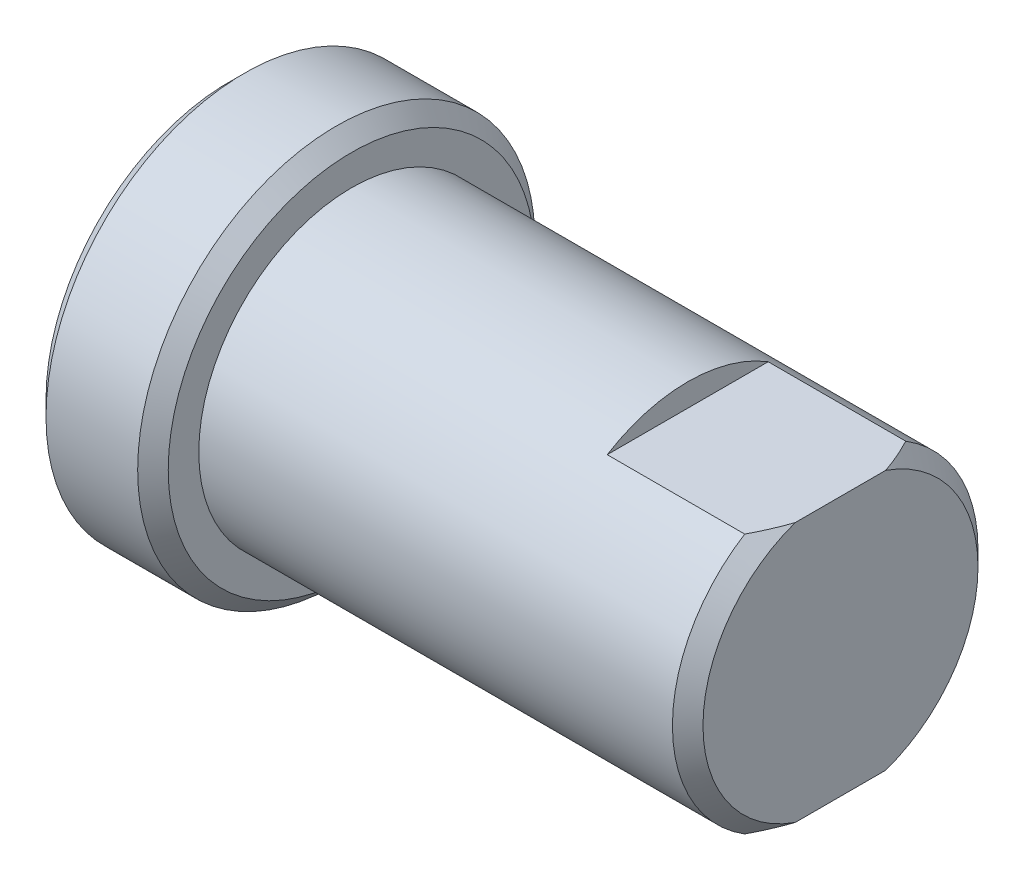
ISO-10303-21;
HEADER;
FILE_DESCRIPTION(('STEP AP214'),'2;1');
FILE_NAME('part.step','',(''),(''),'','','');
FILE_SCHEMA(('AUTOMOTIVE_DESIGN { 1 0 10303 214 1 1 1 1 }'));
ENDSEC;
DATA;
#1=APPLICATION_CONTEXT('core data for automotive mechanical design processes');
#2=APPLICATION_PROTOCOL_DEFINITION('international standard','automotive_design',2000,#1);
#3=PRODUCT_CONTEXT('',#1,'mechanical');
#4=PRODUCT('Part','Part','',(#3));
#5=PRODUCT_RELATED_PRODUCT_CATEGORY('part','',(#4));
#6=PRODUCT_DEFINITION_FORMATION('','',#4);
#7=PRODUCT_DEFINITION_CONTEXT('part definition',#1,'design');
#8=PRODUCT_DEFINITION('design','',#6,#7);
#9=PRODUCT_DEFINITION_SHAPE('','',#8);
#10=(LENGTH_UNIT() NAMED_UNIT(*) SI_UNIT(.MILLI.,.METRE.));
#11=(NAMED_UNIT(*) PLANE_ANGLE_UNIT() SI_UNIT($,.RADIAN.));
#12=(NAMED_UNIT(*) SI_UNIT($,.STERADIAN.) SOLID_ANGLE_UNIT());
#13=UNCERTAINTY_MEASURE_WITH_UNIT(LENGTH_MEASURE(1.E-05),#10,'distance_accuracy_value','');
#14=(GEOMETRIC_REPRESENTATION_CONTEXT(3) GLOBAL_UNCERTAINTY_ASSIGNED_CONTEXT((#13)) GLOBAL_UNIT_ASSIGNED_CONTEXT((#10,
#11,#12)) REPRESENTATION_CONTEXT('',''));
#15=CARTESIAN_POINT('',(0.,0.,0.));
#16=DIRECTION('',(0.,0.,1.));
#17=DIRECTION('',(1.,0.,0.));
#18=AXIS2_PLACEMENT_3D('',#15,#16,#17);
#19=CARTESIAN_POINT('',(0.,0.,0.));
#20=DIRECTION('',(-1.,0.,0.));
#21=DIRECTION('',(0.,0.,1.));
#22=AXIS2_PLACEMENT_3D('',#19,#20,#21);
#23=CYLINDRICAL_SURFACE('',#22,10.);
#24=CARTESIAN_POINT('',(39.,0.,0.));
#25=DIRECTION('',(-1.,0.,0.));
#26=DIRECTION('',(0.,0.,1.));
#27=AXIS2_PLACEMENT_3D('',#24,#25,#26);
#28=CIRCLE('',#27,10.);
#29=CARTESIAN_POINT('',(39.,-8.5,5.26782687642637));
#30=VERTEX_POINT('',#29);
#31=CARTESIAN_POINT('',(39.,8.5,5.26782687642637));
#32=VERTEX_POINT('',#31);
#33=EDGE_CURVE('E133',#30,#32,#28,.T.);
#34=ORIENTED_EDGE('',*,*,#33,.T.);
#35=DIRECTION('',(1.,0.,0.));
#36=VECTOR('',#35,1.);
#37=CARTESIAN_POINT('',(30.,8.5,5.26782687642637));
#38=LINE('',#37,#36);
#39=CARTESIAN_POINT('',(30.,8.5,5.26782687642637));
#40=VERTEX_POINT('',#39);
#41=EDGE_CURVE('E105',#40,#32,#38,.T.);
#42=ORIENTED_EDGE('',*,*,#41,.F.);
#43=CARTESIAN_POINT('',(30.,0.,0.));
#44=DIRECTION('',(1.,0.,0.));
#45=DIRECTION('',(0.,0.,-1.));
#46=AXIS2_PLACEMENT_3D('',#43,#44,#45);
#47=CIRCLE('',#46,10.);
#48=CARTESIAN_POINT('',(30.,8.5,-5.26782687642637));
#49=VERTEX_POINT('',#48);
#50=EDGE_CURVE('E106',#49,#40,#47,.T.);
#51=ORIENTED_EDGE('',*,*,#50,.F.);
#52=DIRECTION('',(1.,0.,0.));
#53=VECTOR('',#52,1.);
#54=CARTESIAN_POINT('',(30.,8.5,-5.26782687642637));
#55=LINE('',#54,#53);
#56=CARTESIAN_POINT('',(39.,8.5,-5.26782687642637));
#57=VERTEX_POINT('',#56);
#58=EDGE_CURVE('E96',#49,#57,#55,.T.);
#59=ORIENTED_EDGE('',*,*,#58,.T.);
#60=CARTESIAN_POINT('',(39.,-8.5,-5.26782687642637));
#61=VERTEX_POINT('',#60);
#62=EDGE_CURVE('E135',#57,#61,#28,.T.);
#63=ORIENTED_EDGE('',*,*,#62,.T.);
#64=DIRECTION('',(1.,0.,0.));
#65=VECTOR('',#64,1.);
#66=CARTESIAN_POINT('',(30.,-8.5,-5.26782687642637));
#67=LINE('',#66,#65);
#68=CARTESIAN_POINT('',(30.,-8.5,-5.26782687642637));
#69=VERTEX_POINT('',#68);
#70=EDGE_CURVE('E61',#69,#61,#67,.T.);
#71=ORIENTED_EDGE('',*,*,#70,.F.);
#72=CARTESIAN_POINT('',(30.,0.,0.));
#73=DIRECTION('',(1.,0.,0.));
#74=DIRECTION('',(0.,0.,-1.));
#75=AXIS2_PLACEMENT_3D('',#72,#73,#74);
#76=CIRCLE('',#75,10.);
#77=CARTESIAN_POINT('',(30.,-8.5,5.26782687642637));
#78=VERTEX_POINT('',#77);
#79=EDGE_CURVE('E121',#78,#69,#76,.T.);
#80=ORIENTED_EDGE('',*,*,#79,.F.);
#81=DIRECTION('',(1.,0.,0.));
#82=VECTOR('',#81,1.);
#83=CARTESIAN_POINT('',(30.,-8.5,5.26782687642637));
#84=LINE('',#83,#82);
#85=EDGE_CURVE('E125',#78,#30,#84,.T.);
#86=ORIENTED_EDGE('',*,*,#85,.T.);
#87=EDGE_LOOP('',(#34,#42,#51,#59,#63,#71,#80,#86));
#88=FACE_BOUND('',#87,.T.);
#89=CARTESIAN_POINT('',(8.,0.,0.));
#90=DIRECTION('',(-1.,0.,0.));
#91=DIRECTION('',(0.,0.,1.));
#92=AXIS2_PLACEMENT_3D('',#89,#90,#91);
#93=CIRCLE('',#92,10.);
#94=CARTESIAN_POINT('',(8.,0.,10.));
#95=VERTEX_POINT('',#94);
#96=EDGE_CURVE('E117',#95,#95,#93,.T.);
#97=ORIENTED_EDGE('',*,*,#96,.F.);
#98=EDGE_LOOP('',(#97));
#99=FACE_BOUND('',#98,.T.);
#100=ADVANCED_FACE('F39',(#88,#99),#23,.T.);
#101=CARTESIAN_POINT('',(40.,10.,0.));
#102=DIRECTION('',(-1.,0.,0.));
#103=DIRECTION('',(0.,0.,1.));
#104=AXIS2_PLACEMENT_3D('',#101,#102,#103);
#105=PLANE('',#104);
#106=CARTESIAN_POINT('',(40.,0.,0.));
#107=DIRECTION('',(-1.,0.,0.));
#108=DIRECTION('',(0.,0.,1.));
#109=AXIS2_PLACEMENT_3D('',#106,#107,#108);
#110=CIRCLE('',#109,9.00000000000001);
#111=CARTESIAN_POINT('',(40.,-8.5,-2.95803989154982));
#112=VERTEX_POINT('',#111);
#113=CARTESIAN_POINT('',(40.,8.5,-2.95803989154982));
#114=VERTEX_POINT('',#113);
#115=EDGE_CURVE('E139',#112,#114,#110,.F.);
#116=ORIENTED_EDGE('',*,*,#115,.T.);
#117=DIRECTION('',(0.,0.,-1.));
#118=VECTOR('',#117,1.);
#119=CARTESIAN_POINT('',(40.,8.5,0.));
#120=LINE('',#119,#118);
#121=CARTESIAN_POINT('',(40.,8.5,2.95803989154982));
#122=VERTEX_POINT('',#121);
#123=EDGE_CURVE('E68',#122,#114,#120,.T.);
#124=ORIENTED_EDGE('',*,*,#123,.F.);
#125=CARTESIAN_POINT('',(40.,-8.5,2.95803989154982));
#126=VERTEX_POINT('',#125);
#127=EDGE_CURVE('E136',#122,#126,#110,.F.);
#128=ORIENTED_EDGE('',*,*,#127,.T.);
#129=DIRECTION('',(0.,0.,-1.));
#130=VECTOR('',#129,1.);
#131=CARTESIAN_POINT('',(40.,-8.5,0.));
#132=LINE('',#131,#130);
#133=EDGE_CURVE('E122',#126,#112,#132,.T.);
#134=ORIENTED_EDGE('',*,*,#133,.T.);
#135=EDGE_LOOP('',(#116,#124,#128,#134));
#136=FACE_BOUND('',#135,.T.);
#137=ADVANCED_FACE('F168',(#136),#105,.F.);
#138=CARTESIAN_POINT('',(39.,0.,0.));
#139=DIRECTION('',(-1.,0.,0.));
#140=DIRECTION('',(0.,0.,1.));
#141=AXIS2_PLACEMENT_3D('',#138,#139,#140);
#142=CONICAL_SURFACE('',#141,10.,0.785398163397449);
#143=CARTESIAN_POINT('',(38.9996312344181,8.5,5.26852687642637));
#144=CARTESIAN_POINT('',(39.077972325852,8.5,5.11980819327335));
#145=CARTESIAN_POINT('',(39.1544507002125,8.5,4.97011050835295));
#146=CARTESIAN_POINT('',(39.3031791069158,8.5,4.6685736748035));
#147=CARTESIAN_POINT('',(39.3754278077059,8.5,4.51673387027988));
#148=CARTESIAN_POINT('',(39.5855154846741,8.5,4.05674322684233));
#149=CARTESIAN_POINT('',(39.7161126507249,8.5,3.74521161122492));
#150=CARTESIAN_POINT('',(39.95195154019,8.5,3.11480840665927));
#151=CARTESIAN_POINT('',(40.0573471105829,8.5,2.79599508774368));
#152=CARTESIAN_POINT('',(40.2377188501364,8.5,2.15018428460635));
#153=CARTESIAN_POINT('',(40.312741723355,8.5,1.82320019303692));
#154=CARTESIAN_POINT('',(40.4133290900383,8.5,1.2418633350294));
#155=CARTESIAN_POINT('',(40.4464260657337,8.5,0.988812825209476));
#156=CARTESIAN_POINT('',(40.4901780949247,8.5,0.480703270576122));
#157=CARTESIAN_POINT('',(40.5008303856471,8.5,0.225643982375188));
#158=CARTESIAN_POINT('',(40.4990680600373,8.5,-0.284405204908195));
#159=CARTESIAN_POINT('',(40.486652369327,8.5,-0.539395100205509));
#160=CARTESIAN_POINT('',(40.439468220212,8.5,-1.047223351283));
#161=CARTESIAN_POINT('',(40.4047022888079,8.5,-1.30006194702291));
#162=CARTESIAN_POINT('',(40.3012930855767,8.5,-1.87607874851993));
#163=CARTESIAN_POINT('',(40.2256817448985,8.5,-2.19800528413208));
#164=CARTESIAN_POINT('',(40.045255730485,8.5,-2.83385907093727));
#165=CARTESIAN_POINT('',(39.9403988648139,8.5,-3.14777404444485));
#166=CARTESIAN_POINT('',(39.7065793852755,8.5,-3.76839617847601));
#167=CARTESIAN_POINT('',(39.5774850153648,8.5,-4.075053106477));
#168=CARTESIAN_POINT('',(39.3701143742712,8.5,-4.52798075794953));
#169=CARTESIAN_POINT('',(39.2988387935341,8.5,-4.67752574357621));
#170=CARTESIAN_POINT('',(39.1521878908412,8.5,-4.97453920229394));
#171=CARTESIAN_POINT('',(39.0768137930368,8.5,-5.12200827903376));
#172=CARTESIAN_POINT('',(38.9996312344181,8.5,-5.26852687642637));
#173=B_SPLINE_CURVE_WITH_KNOTS('',3,(#143,#144,#145,#146,#147,#148,#149,#150,#151,#152,#153,
#154,#155,#156,#157,#158,#159,#160,#161,#162,#163,#164,#165,#166,#167,#168,#169,#170,#171,#172),
.UNSPECIFIED.,.F.,.F.,(4,2,2,2,2,2,2,2,2,2,2,2,2,2,4),(0.,0.50424754493332,1.00865298882726,
2.02116819301139,3.02733481985453,4.03194833470155,4.79665767249459,5.56146113479751,
6.32630021828035,7.09105284144157,8.08139367687037,9.07317071410504,10.0705039588876,
10.5674408491548,11.0642301202271),.UNSPECIFIED.);
#174=EDGE_CURVE('E11',#32,#122,#173,.T.);
#175=ORIENTED_EDGE('',*,*,#174,.F.);
#176=ORIENTED_EDGE('',*,*,#33,.F.);
#177=CARTESIAN_POINT('',(38.9996312344181,-8.5,5.26852687642637));
#178=CARTESIAN_POINT('',(39.077972325852,-8.5,5.11980819327335));
#179=CARTESIAN_POINT('',(39.1544507002125,-8.5,4.97011050835295));
#180=CARTESIAN_POINT('',(39.3031791069158,-8.5,4.6685736748035));
#181=CARTESIAN_POINT('',(39.3754278077059,-8.5,4.51673387027988));
#182=CARTESIAN_POINT('',(39.5855154846741,-8.5,4.05674322684233));
#183=CARTESIAN_POINT('',(39.7161126507249,-8.5,3.74521161122492));
#184=CARTESIAN_POINT('',(39.95195154019,-8.5,3.11480840665927));
#185=CARTESIAN_POINT('',(40.0573471105829,-8.5,2.79599508774368));
#186=CARTESIAN_POINT('',(40.2377188501364,-8.5,2.15018428460635));
#187=CARTESIAN_POINT('',(40.312741723355,-8.5,1.82320019303692));
#188=CARTESIAN_POINT('',(40.4133290900383,-8.5,1.2418633350294));
#189=CARTESIAN_POINT('',(40.4464260657337,-8.5,0.988812825209476));
#190=CARTESIAN_POINT('',(40.4901780949247,-8.5,0.480703270576122));
#191=CARTESIAN_POINT('',(40.5008303856471,-8.5,0.225643982375188));
#192=CARTESIAN_POINT('',(40.4990680600373,-8.5,-0.284405204908195));
#193=CARTESIAN_POINT('',(40.486652369327,-8.5,-0.539395100205509));
#194=CARTESIAN_POINT('',(40.439468220212,-8.5,-1.047223351283));
#195=CARTESIAN_POINT('',(40.4047022888079,-8.5,-1.30006194702291));
#196=CARTESIAN_POINT('',(40.3012930855767,-8.5,-1.87607874851993));
#197=CARTESIAN_POINT('',(40.2256817448985,-8.5,-2.19800528413208));
#198=CARTESIAN_POINT('',(40.045255730485,-8.5,-2.83385907093727));
#199=CARTESIAN_POINT('',(39.9403988648139,-8.5,-3.14777404444485));
#200=CARTESIAN_POINT('',(39.7065793852755,-8.5,-3.76839617847601));
#201=CARTESIAN_POINT('',(39.5774850153648,-8.5,-4.075053106477));
#202=CARTESIAN_POINT('',(39.3701143742712,-8.5,-4.52798075794953));
#203=CARTESIAN_POINT('',(39.2988387935341,-8.5,-4.67752574357621));
#204=CARTESIAN_POINT('',(39.1521878908412,-8.5,-4.97453920229394));
#205=CARTESIAN_POINT('',(39.0768137930368,-8.5,-5.12200827903376));
#206=CARTESIAN_POINT('',(38.9996312344181,-8.5,-5.26852687642637));
#207=B_SPLINE_CURVE_WITH_KNOTS('',3,(#177,#178,#179,#180,#181,#182,#183,#184,#185,#186,#187,
#188,#189,#190,#191,#192,#193,#194,#195,#196,#197,#198,#199,#200,#201,#202,#203,#204,#205,#206),
.UNSPECIFIED.,.F.,.F.,(4,2,2,2,2,2,2,2,2,2,2,2,2,2,4),(0.,0.50424754493332,1.00865298882726,
2.02116819301139,3.02733481985453,4.03194833470155,4.79665767249459,5.56146113479751,
6.32630021828035,7.09105284144157,8.08139367687037,9.07317071410504,10.0705039588876,
10.5674408491548,11.0642301202271),.UNSPECIFIED.);
#208=EDGE_CURVE('E157',#30,#126,#207,.T.);
#209=ORIENTED_EDGE('',*,*,#208,.T.);
#210=ORIENTED_EDGE('',*,*,#127,.F.);
#211=EDGE_LOOP('',(#175,#176,#209,#210));
#212=FACE_BOUND('',#211,.T.);
#213=ADVANCED_FACE('F159',(#212),#142,.T.);
#214=EDGE_CURVE('E44',#114,#57,#173,.T.);
#215=ORIENTED_EDGE('',*,*,#214,.F.);
#216=ORIENTED_EDGE('',*,*,#115,.F.);
#217=EDGE_CURVE('E151',#112,#61,#207,.T.);
#218=ORIENTED_EDGE('',*,*,#217,.T.);
#219=ORIENTED_EDGE('',*,*,#62,.F.);
#220=EDGE_LOOP('',(#215,#216,#218,#219));
#221=FACE_BOUND('',#220,.T.);
#222=ADVANCED_FACE('F184',(#221),#142,.T.);
#223=CARTESIAN_POINT('',(0.,0.,0.));
#224=DIRECTION('',(1.,0.,0.));
#225=DIRECTION('',(0.,0.,-1.));
#226=AXIS2_PLACEMENT_3D('',#223,#224,#225);
#227=PLANE('',#226);
#228=CARTESIAN_POINT('',(0.,0.,0.));
#229=DIRECTION('',(1.,0.,0.));
#230=DIRECTION('',(0.,0.,-1.));
#231=AXIS2_PLACEMENT_3D('',#228,#229,#230);
#232=CIRCLE('',#231,12.);
#233=CARTESIAN_POINT('',(0.,0.,-12.));
#234=VERTEX_POINT('',#233);
#235=EDGE_CURVE('E149',#234,#234,#232,.F.);
#236=ORIENTED_EDGE('',*,*,#235,.T.);
#237=EDGE_LOOP('',(#236));
#238=FACE_BOUND('',#237,.T.);
#239=ADVANCED_FACE('F181',(#238),#227,.F.);
#240=CARTESIAN_POINT('',(0.,0.,0.));
#241=DIRECTION('',(-1.,0.,0.));
#242=DIRECTION('',(0.,0.,1.));
#243=AXIS2_PLACEMENT_3D('',#240,#241,#242);
#244=CYLINDRICAL_SURFACE('',#243,13.);
#245=CARTESIAN_POINT('',(7.,0.,0.));
#246=DIRECTION('',(-1.,0.,0.));
#247=DIRECTION('',(0.,0.,1.));
#248=AXIS2_PLACEMENT_3D('',#245,#246,#247);
#249=CIRCLE('',#248,13.);
#250=CARTESIAN_POINT('',(7.,0.,13.));
#251=VERTEX_POINT('',#250);
#252=EDGE_CURVE('E143',#251,#251,#249,.T.);
#253=ORIENTED_EDGE('',*,*,#252,.T.);
#254=EDGE_LOOP('',(#253));
#255=FACE_BOUND('',#254,.T.);
#256=CARTESIAN_POINT('',(0.999999999999994,0.,0.));
#257=DIRECTION('',(1.,0.,0.));
#258=DIRECTION('',(0.,0.,-1.));
#259=AXIS2_PLACEMENT_3D('',#256,#257,#258);
#260=CIRCLE('',#259,13.);
#261=CARTESIAN_POINT('',(0.999999999999994,0.,-13.));
#262=VERTEX_POINT('',#261);
#263=EDGE_CURVE('E140',#262,#262,#260,.T.);
#264=ORIENTED_EDGE('',*,*,#263,.T.);
#265=EDGE_LOOP('',(#264));
#266=FACE_BOUND('',#265,.T.);
#267=ADVANCED_FACE('F178',(#255,#266),#244,.T.);
#268=CARTESIAN_POINT('',(8.,13.,0.));
#269=DIRECTION('',(-1.,0.,0.));
#270=DIRECTION('',(0.,0.,1.));
#271=AXIS2_PLACEMENT_3D('',#268,#269,#270);
#272=PLANE('',#271);
#273=CARTESIAN_POINT('',(8.,0.,0.));
#274=DIRECTION('',(-1.,0.,0.));
#275=DIRECTION('',(0.,0.,1.));
#276=AXIS2_PLACEMENT_3D('',#273,#274,#275);
#277=CIRCLE('',#276,12.);
#278=CARTESIAN_POINT('',(8.,0.,12.));
#279=VERTEX_POINT('',#278);
#280=EDGE_CURVE('E146',#279,#279,#277,.F.);
#281=ORIENTED_EDGE('',*,*,#280,.T.);
#282=EDGE_LOOP('',(#281));
#283=FACE_BOUND('',#282,.T.);
#284=ORIENTED_EDGE('',*,*,#96,.T.);
#285=EDGE_LOOP('',(#284));
#286=FACE_BOUND('',#285,.T.);
#287=ADVANCED_FACE('F174',(#283,#286),#272,.F.);
#288=CARTESIAN_POINT('',(7.,0.,0.));
#289=DIRECTION('',(-1.,0.,0.));
#290=DIRECTION('',(0.,0.,1.));
#291=AXIS2_PLACEMENT_3D('',#288,#289,#290);
#292=CONICAL_SURFACE('',#291,13.,0.785398163397451);
#293=ORIENTED_EDGE('',*,*,#280,.F.);
#294=EDGE_LOOP('',(#293));
#295=FACE_BOUND('',#294,.T.);
#296=ORIENTED_EDGE('',*,*,#252,.F.);
#297=EDGE_LOOP('',(#296));
#298=FACE_BOUND('',#297,.T.);
#299=ADVANCED_FACE('F177',(#295,#298),#292,.T.);
#300=CARTESIAN_POINT('',(0.,0.,0.));
#301=DIRECTION('',(1.,0.,0.));
#302=DIRECTION('',(0.,0.,-1.));
#303=AXIS2_PLACEMENT_3D('',#300,#301,#302);
#304=CONICAL_SURFACE('',#303,12.,0.785398163397446);
#305=ORIENTED_EDGE('',*,*,#263,.F.);
#306=EDGE_LOOP('',(#305));
#307=FACE_BOUND('',#306,.T.);
#308=ORIENTED_EDGE('',*,*,#235,.F.);
#309=EDGE_LOOP('',(#308));
#310=FACE_BOUND('',#309,.T.);
#311=ADVANCED_FACE('F42',(#307,#310),#304,.T.);
#312=CARTESIAN_POINT('',(30.,-8.5,0.));
#313=DIRECTION('',(0.,-1.,0.));
#314=DIRECTION('',(0.,0.,-1.));
#315=AXIS2_PLACEMENT_3D('',#312,#313,#314);
#316=PLANE('',#315);
#317=ORIENTED_EDGE('',*,*,#85,.F.);
#318=DIRECTION('',(0.,0.,-1.));
#319=VECTOR('',#318,1.);
#320=CARTESIAN_POINT('',(30.,-8.5,0.));
#321=LINE('',#320,#319);
#322=EDGE_CURVE('E119',#78,#69,#321,.T.);
#323=ORIENTED_EDGE('',*,*,#322,.T.);
#324=ORIENTED_EDGE('',*,*,#70,.T.);
#325=ORIENTED_EDGE('',*,*,#217,.F.);
#326=ORIENTED_EDGE('',*,*,#133,.F.);
#327=ORIENTED_EDGE('',*,*,#208,.F.);
#328=EDGE_LOOP('',(#317,#323,#324,#325,#326,#327));
#329=FACE_BOUND('',#328,.T.);
#330=ADVANCED_FACE('F162',(#329),#316,.T.);
#331=CARTESIAN_POINT('',(30.,0.,0.));
#332=DIRECTION('',(1.,0.,0.));
#333=DIRECTION('',(0.,0.,-1.));
#334=AXIS2_PLACEMENT_3D('',#331,#332,#333);
#335=PLANE('',#334);
#336=ORIENTED_EDGE('',*,*,#322,.F.);
#337=ORIENTED_EDGE('',*,*,#79,.T.);
#338=EDGE_LOOP('',(#336,#337));
#339=FACE_BOUND('',#338,.T.);
#340=ADVANCED_FACE('F167',(#339),#335,.T.);
#341=CARTESIAN_POINT('',(30.,8.5,0.));
#342=DIRECTION('',(0.,-1.,0.));
#343=DIRECTION('',(0.,0.,-1.));
#344=AXIS2_PLACEMENT_3D('',#341,#342,#343);
#345=PLANE('',#344);
#346=ORIENTED_EDGE('',*,*,#174,.T.);
#347=ORIENTED_EDGE('',*,*,#123,.T.);
#348=ORIENTED_EDGE('',*,*,#214,.T.);
#349=ORIENTED_EDGE('',*,*,#58,.F.);
#350=DIRECTION('',(0.,0.,-1.));
#351=VECTOR('',#350,1.);
#352=CARTESIAN_POINT('',(30.,8.5,0.));
#353=LINE('',#352,#351);
#354=EDGE_CURVE('E99',#40,#49,#353,.T.);
#355=ORIENTED_EDGE('',*,*,#354,.F.);
#356=ORIENTED_EDGE('',*,*,#41,.T.);
#357=EDGE_LOOP('',(#346,#347,#348,#349,#355,#356));
#358=FACE_BOUND('',#357,.T.);
#359=ADVANCED_FACE('F98',(#358),#345,.F.);
#360=CARTESIAN_POINT('',(30.,0.,0.));
#361=DIRECTION('',(1.,0.,0.));
#362=DIRECTION('',(0.,0.,-1.));
#363=AXIS2_PLACEMENT_3D('',#360,#361,#362);
#364=PLANE('',#363);
#365=ORIENTED_EDGE('',*,*,#354,.T.);
#366=ORIENTED_EDGE('',*,*,#50,.T.);
#367=EDGE_LOOP('',(#365,#366));
#368=FACE_BOUND('',#367,.T.);
#369=ADVANCED_FACE('F109',(#368),#364,.T.);
#370=CLOSED_SHELL('',(#100,#137,#213,#222,#239,#267,#287,#299,#311,#330,#340,#359,#369));
#371=MANIFOLD_SOLID_BREP('B2',#370);
#372=ADVANCED_BREP_SHAPE_REPRESENTATION('',(#18,#371),#14);
#373=SHAPE_DEFINITION_REPRESENTATION(#9,#372);
ENDSEC;
END-ISO-10303-21;
